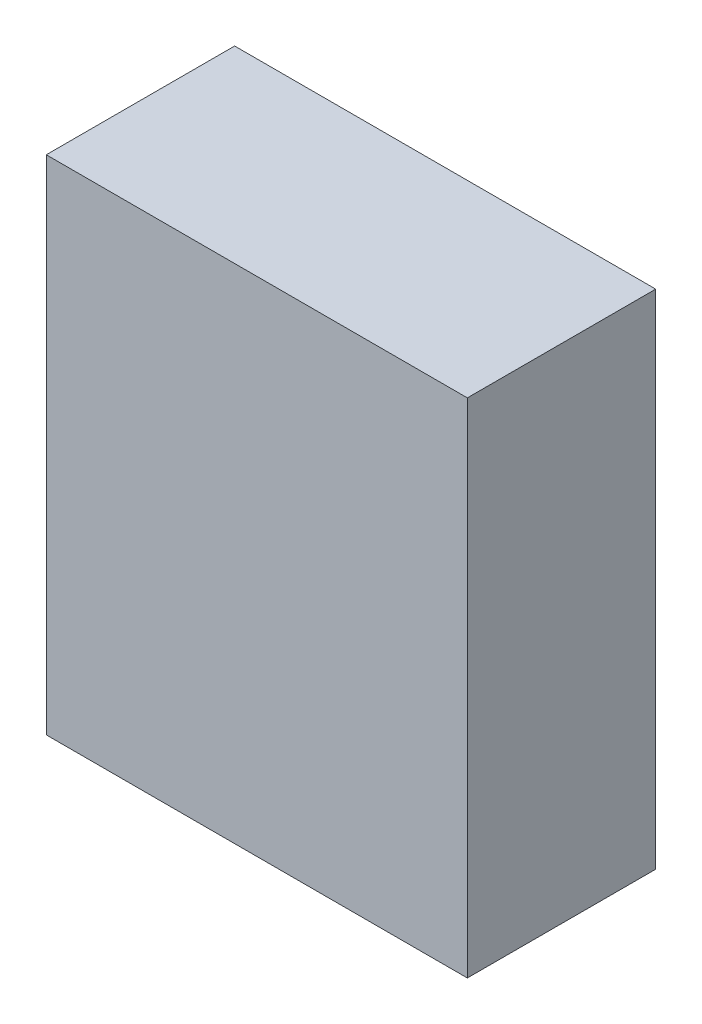
ISO-10303-21;
HEADER;
FILE_DESCRIPTION(('STEP AP214'),'2;1');
FILE_NAME('part.step','',(''),(''),'','','');
FILE_SCHEMA(('AUTOMOTIVE_DESIGN { 1 0 10303 214 1 1 1 1 }'));
ENDSEC;
DATA;
#1=APPLICATION_CONTEXT('core data for automotive mechanical design processes');
#2=APPLICATION_PROTOCOL_DEFINITION('international standard','automotive_design',2000,#1);
#3=PRODUCT_CONTEXT('',#1,'mechanical');
#4=PRODUCT('Part','Part','',(#3));
#5=PRODUCT_RELATED_PRODUCT_CATEGORY('part','',(#4));
#6=PRODUCT_DEFINITION_FORMATION('','',#4);
#7=PRODUCT_DEFINITION_CONTEXT('part definition',#1,'design');
#8=PRODUCT_DEFINITION('design','',#6,#7);
#9=PRODUCT_DEFINITION_SHAPE('','',#8);
#10=(LENGTH_UNIT() NAMED_UNIT(*) SI_UNIT(.MILLI.,.METRE.));
#11=(NAMED_UNIT(*) PLANE_ANGLE_UNIT() SI_UNIT($,.RADIAN.));
#12=(NAMED_UNIT(*) SI_UNIT($,.STERADIAN.) SOLID_ANGLE_UNIT());
#13=UNCERTAINTY_MEASURE_WITH_UNIT(LENGTH_MEASURE(1.E-05),#10,'distance_accuracy_value','');
#14=(GEOMETRIC_REPRESENTATION_CONTEXT(3) GLOBAL_UNCERTAINTY_ASSIGNED_CONTEXT((#13)) GLOBAL_UNIT_ASSIGNED_CONTEXT((#10,
#11,#12)) REPRESENTATION_CONTEXT('',''));
#15=CARTESIAN_POINT('',(0.,0.,0.));
#16=DIRECTION('',(0.,0.,1.));
#17=DIRECTION('',(1.,0.,0.));
#18=AXIS2_PLACEMENT_3D('',#15,#16,#17);
#19=CARTESIAN_POINT('',(-1.1176,-1.4224,1.));
#20=DIRECTION('',(1.,0.,0.));
#21=DIRECTION('',(0.,0.,-1.));
#22=AXIS2_PLACEMENT_3D('',#19,#20,#21);
#23=PLANE('',#22);
#24=DIRECTION('',(0.,-1.,0.));
#25=VECTOR('',#24,1.);
#26=CARTESIAN_POINT('',(-1.1176,-1.4224,0.));
#27=LINE('',#26,#25);
#28=CARTESIAN_POINT('',(-1.1176,1.2446,0.));
#29=VERTEX_POINT('',#28);
#30=CARTESIAN_POINT('',(-1.1176,-1.4224,0.));
#31=VERTEX_POINT('',#30);
#32=EDGE_CURVE('E95',#29,#31,#27,.T.);
#33=ORIENTED_EDGE('',*,*,#32,.T.);
#34=DIRECTION('',(0.,0.,-1.));
#35=VECTOR('',#34,1.);
#36=CARTESIAN_POINT('',(-1.1176,-1.4224,1.));
#37=LINE('',#36,#35);
#38=CARTESIAN_POINT('',(-1.1176,-1.4224,1.));
#39=VERTEX_POINT('',#38);
#40=EDGE_CURVE('E11',#39,#31,#37,.T.);
#41=ORIENTED_EDGE('',*,*,#40,.F.);
#42=DIRECTION('',(0.,-1.,0.));
#43=VECTOR('',#42,1.);
#44=CARTESIAN_POINT('',(-1.1176,-1.4224,1.));
#45=LINE('',#44,#43);
#46=CARTESIAN_POINT('',(-1.1176,1.2446,1.));
#47=VERTEX_POINT('',#46);
#48=EDGE_CURVE('E83',#47,#39,#45,.T.);
#49=ORIENTED_EDGE('',*,*,#48,.F.);
#50=DIRECTION('',(0.,0.,-1.));
#51=VECTOR('',#50,1.);
#52=CARTESIAN_POINT('',(-1.1176,1.2446,1.));
#53=LINE('',#52,#51);
#54=EDGE_CURVE('E91',#47,#29,#53,.T.);
#55=ORIENTED_EDGE('',*,*,#54,.T.);
#56=EDGE_LOOP('',(#33,#41,#49,#55));
#57=FACE_BOUND('',#56,.T.);
#58=ADVANCED_FACE('F32',(#57),#23,.F.);
#59=CARTESIAN_POINT('',(1.1176,-1.4224,1.));
#60=DIRECTION('',(0.,1.,0.));
#61=DIRECTION('',(0.,0.,1.));
#62=AXIS2_PLACEMENT_3D('',#59,#60,#61);
#63=PLANE('',#62);
#64=DIRECTION('',(1.,0.,0.));
#65=VECTOR('',#64,1.);
#66=CARTESIAN_POINT('',(1.1176,-1.4224,0.));
#67=LINE('',#66,#65);
#68=CARTESIAN_POINT('',(1.1176,-1.4224,0.));
#69=VERTEX_POINT('',#68);
#70=EDGE_CURVE('E87',#31,#69,#67,.T.);
#71=ORIENTED_EDGE('',*,*,#70,.T.);
#72=DIRECTION('',(0.,0.,-1.));
#73=VECTOR('',#72,1.);
#74=CARTESIAN_POINT('',(1.1176,-1.4224,1.));
#75=LINE('',#74,#73);
#76=CARTESIAN_POINT('',(1.1176,-1.4224,1.));
#77=VERTEX_POINT('',#76);
#78=EDGE_CURVE('E40',#77,#69,#75,.T.);
#79=ORIENTED_EDGE('',*,*,#78,.F.);
#80=DIRECTION('',(1.,0.,0.));
#81=VECTOR('',#80,1.);
#82=CARTESIAN_POINT('',(1.1176,-1.4224,1.));
#83=LINE('',#82,#81);
#84=EDGE_CURVE('E78',#39,#77,#83,.T.);
#85=ORIENTED_EDGE('',*,*,#84,.F.);
#86=ORIENTED_EDGE('',*,*,#40,.T.);
#87=EDGE_LOOP('',(#71,#79,#85,#86));
#88=FACE_BOUND('',#87,.T.);
#89=ADVANCED_FACE('F86',(#88),#63,.F.);
#90=CARTESIAN_POINT('',(1.1176,1.2446,1.));
#91=DIRECTION('',(-1.,0.,0.));
#92=DIRECTION('',(0.,0.,1.));
#93=AXIS2_PLACEMENT_3D('',#90,#91,#92);
#94=PLANE('',#93);
#95=DIRECTION('',(0.,1.,0.));
#96=VECTOR('',#95,1.);
#97=CARTESIAN_POINT('',(1.1176,1.2446,0.));
#98=LINE('',#97,#96);
#99=CARTESIAN_POINT('',(1.1176,1.2446,0.));
#100=VERTEX_POINT('',#99);
#101=EDGE_CURVE('E65',#69,#100,#98,.T.);
#102=ORIENTED_EDGE('',*,*,#101,.T.);
#103=DIRECTION('',(0.,0.,-1.));
#104=VECTOR('',#103,1.);
#105=CARTESIAN_POINT('',(1.1176,1.2446,1.));
#106=LINE('',#105,#104);
#107=CARTESIAN_POINT('',(1.1176,1.2446,1.));
#108=VERTEX_POINT('',#107);
#109=EDGE_CURVE('E88',#108,#100,#106,.T.);
#110=ORIENTED_EDGE('',*,*,#109,.F.);
#111=DIRECTION('',(0.,1.,0.));
#112=VECTOR('',#111,1.);
#113=CARTESIAN_POINT('',(1.1176,1.2446,1.));
#114=LINE('',#113,#112);
#115=EDGE_CURVE('E81',#77,#108,#114,.T.);
#116=ORIENTED_EDGE('',*,*,#115,.F.);
#117=ORIENTED_EDGE('',*,*,#78,.T.);
#118=EDGE_LOOP('',(#102,#110,#116,#117));
#119=FACE_BOUND('',#118,.T.);
#120=ADVANCED_FACE('F89',(#119),#94,.F.);
#121=CARTESIAN_POINT('',(-1.1176,1.2446,1.));
#122=DIRECTION('',(0.,-1.,0.));
#123=DIRECTION('',(0.,0.,-1.));
#124=AXIS2_PLACEMENT_3D('',#121,#122,#123);
#125=PLANE('',#124);
#126=DIRECTION('',(-1.,0.,0.));
#127=VECTOR('',#126,1.);
#128=CARTESIAN_POINT('',(-1.1176,1.2446,0.));
#129=LINE('',#128,#127);
#130=EDGE_CURVE('E71',#100,#29,#129,.T.);
#131=ORIENTED_EDGE('',*,*,#130,.T.);
#132=ORIENTED_EDGE('',*,*,#54,.F.);
#133=DIRECTION('',(-1.,0.,0.));
#134=VECTOR('',#133,1.);
#135=CARTESIAN_POINT('',(-1.1176,1.2446,1.));
#136=LINE('',#135,#134);
#137=EDGE_CURVE('E48',#108,#47,#136,.T.);
#138=ORIENTED_EDGE('',*,*,#137,.F.);
#139=ORIENTED_EDGE('',*,*,#109,.T.);
#140=EDGE_LOOP('',(#131,#132,#138,#139));
#141=FACE_BOUND('',#140,.T.);
#142=ADVANCED_FACE('F102',(#141),#125,.F.);
#143=CARTESIAN_POINT('',(0.,0.,1.));
#144=DIRECTION('',(0.,0.,-1.));
#145=DIRECTION('',(-1.,0.,0.));
#146=AXIS2_PLACEMENT_3D('',#143,#144,#145);
#147=PLANE('',#146);
#148=ORIENTED_EDGE('',*,*,#48,.T.);
#149=ORIENTED_EDGE('',*,*,#84,.T.);
#150=ORIENTED_EDGE('',*,*,#115,.T.);
#151=ORIENTED_EDGE('',*,*,#137,.T.);
#152=EDGE_LOOP('',(#148,#149,#150,#151));
#153=FACE_BOUND('',#152,.T.);
#154=ADVANCED_FACE('F79',(#153),#147,.F.);
#155=CARTESIAN_POINT('',(0.,0.,0.));
#156=DIRECTION('',(0.,0.,-1.));
#157=DIRECTION('',(-1.,0.,0.));
#158=AXIS2_PLACEMENT_3D('',#155,#156,#157);
#159=PLANE('',#158);
#160=ORIENTED_EDGE('',*,*,#32,.F.);
#161=ORIENTED_EDGE('',*,*,#130,.F.);
#162=ORIENTED_EDGE('',*,*,#101,.F.);
#163=ORIENTED_EDGE('',*,*,#70,.F.);
#164=EDGE_LOOP('',(#160,#161,#162,#163));
#165=FACE_BOUND('',#164,.T.);
#166=ADVANCED_FACE('F105',(#165),#159,.T.);
#167=CLOSED_SHELL('',(#58,#89,#120,#142,#154,#166));
#168=MANIFOLD_SOLID_BREP('B2',#167);
#169=ADVANCED_BREP_SHAPE_REPRESENTATION('',(#18,#168),#14);
#170=SHAPE_DEFINITION_REPRESENTATION(#9,#169);
ENDSEC;
END-ISO-10303-21;
